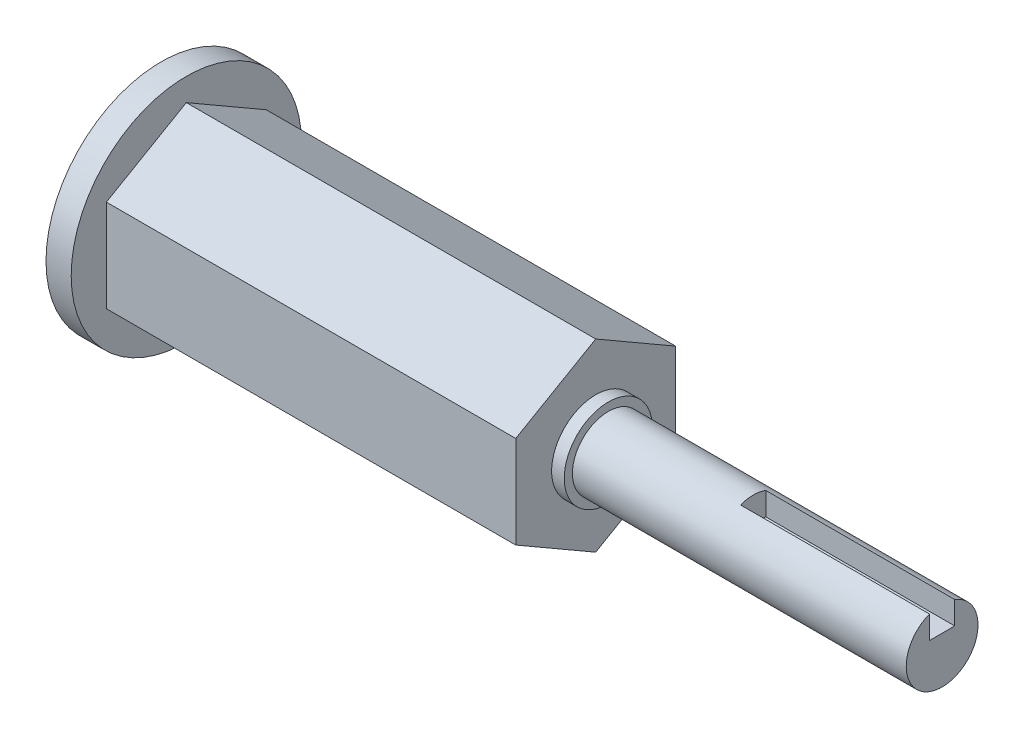
ISO-10303-21;
HEADER;
FILE_DESCRIPTION(('STEP AP214'),'2;1');
FILE_NAME('part.step','',(''),(''),'','','');
FILE_SCHEMA(('AUTOMOTIVE_DESIGN { 1 0 10303 214 1 1 1 1 }'));
ENDSEC;
DATA;
#1=APPLICATION_CONTEXT('core data for automotive mechanical design processes');
#2=APPLICATION_PROTOCOL_DEFINITION('international standard','automotive_design',2000,#1);
#3=PRODUCT_CONTEXT('',#1,'mechanical');
#4=PRODUCT('Part','Part','',(#3));
#5=PRODUCT_RELATED_PRODUCT_CATEGORY('part','',(#4));
#6=PRODUCT_DEFINITION_FORMATION('','',#4);
#7=PRODUCT_DEFINITION_CONTEXT('part definition',#1,'design');
#8=PRODUCT_DEFINITION('design','',#6,#7);
#9=PRODUCT_DEFINITION_SHAPE('','',#8);
#10=(LENGTH_UNIT() NAMED_UNIT(*) SI_UNIT(.MILLI.,.METRE.));
#11=(NAMED_UNIT(*) PLANE_ANGLE_UNIT() SI_UNIT($,.RADIAN.));
#12=(NAMED_UNIT(*) SI_UNIT($,.STERADIAN.) SOLID_ANGLE_UNIT());
#13=UNCERTAINTY_MEASURE_WITH_UNIT(LENGTH_MEASURE(1.E-05),#10,'distance_accuracy_value','');
#14=(GEOMETRIC_REPRESENTATION_CONTEXT(3) GLOBAL_UNCERTAINTY_ASSIGNED_CONTEXT((#13)) GLOBAL_UNIT_ASSIGNED_CONTEXT((#10,
#11,#12)) REPRESENTATION_CONTEXT('',''));
#15=CARTESIAN_POINT('',(0.,0.,0.));
#16=DIRECTION('',(0.,0.,1.));
#17=DIRECTION('',(1.,0.,0.));
#18=AXIS2_PLACEMENT_3D('',#15,#16,#17);
#19=CARTESIAN_POINT('',(0.,0.,0.));
#20=DIRECTION('',(-1.,0.,0.));
#21=DIRECTION('',(0.,0.,1.));
#22=AXIS2_PLACEMENT_3D('',#19,#20,#21);
#23=PLANE('',#22);
#24=CARTESIAN_POINT('',(0.,0.,0.));
#25=DIRECTION('',(-1.,0.,0.));
#26=DIRECTION('',(0.,0.,1.));
#27=AXIS2_PLACEMENT_3D('',#24,#25,#26);
#28=CIRCLE('',#27,9.141);
#29=CARTESIAN_POINT('',(0.,0.,9.141));
#30=VERTEX_POINT('',#29);
#31=EDGE_CURVE('E191',#30,#30,#28,.T.);
#32=ORIENTED_EDGE('',*,*,#31,.F.);
#33=EDGE_LOOP('',(#32));
#34=FACE_BOUND('',#33,.T.);
#35=DIRECTION('',(0.,-0.5,0.866025403784439));
#36=VECTOR('',#35,1.);
#37=CARTESIAN_POINT('',(0.,7.33,0.));
#38=LINE('',#37,#36);
#39=CARTESIAN_POINT('',(0.,7.33,0.));
#40=VERTEX_POINT('',#39);
#41=CARTESIAN_POINT('',(0.,3.665,6.34796620973994));
#42=VERTEX_POINT('',#41);
#43=EDGE_CURVE('E146',#40,#42,#38,.T.);
#44=ORIENTED_EDGE('',*,*,#43,.F.);
#45=DIRECTION('',(0.,0.5,0.866025403784439));
#46=VECTOR('',#45,1.);
#47=CARTESIAN_POINT('',(0.,3.665,-6.34796620973994));
#48=LINE('',#47,#46);
#49=CARTESIAN_POINT('',(0.,3.665,-6.34796620973994));
#50=VERTEX_POINT('',#49);
#51=EDGE_CURVE('E152',#50,#40,#48,.T.);
#52=ORIENTED_EDGE('',*,*,#51,.F.);
#53=DIRECTION('',(0.,1.,0.));
#54=VECTOR('',#53,1.);
#55=CARTESIAN_POINT('',(0.,-3.665,-6.34796620973994));
#56=LINE('',#55,#54);
#57=CARTESIAN_POINT('',(0.,-3.665,-6.34796620973994));
#58=VERTEX_POINT('',#57);
#59=EDGE_CURVE('E170',#58,#50,#56,.T.);
#60=ORIENTED_EDGE('',*,*,#59,.F.);
#61=DIRECTION('',(0.,0.5,-0.866025403784439));
#62=VECTOR('',#61,1.);
#63=CARTESIAN_POINT('',(0.,-7.33,0.));
#64=LINE('',#63,#62);
#65=CARTESIAN_POINT('',(0.,-7.33,0.));
#66=VERTEX_POINT('',#65);
#67=EDGE_CURVE('E167',#66,#58,#64,.T.);
#68=ORIENTED_EDGE('',*,*,#67,.F.);
#69=DIRECTION('',(0.,-0.5,-0.866025403784439));
#70=VECTOR('',#69,1.);
#71=CARTESIAN_POINT('',(0.,-3.665,6.34796620973994));
#72=LINE('',#71,#70);
#73=CARTESIAN_POINT('',(0.,-3.665,6.34796620973994));
#74=VERTEX_POINT('',#73);
#75=EDGE_CURVE('E60',#74,#66,#72,.T.);
#76=ORIENTED_EDGE('',*,*,#75,.F.);
#77=DIRECTION('',(0.,-1.,0.));
#78=VECTOR('',#77,1.);
#79=CARTESIAN_POINT('',(0.,3.665,6.34796620973994));
#80=LINE('',#79,#78);
#81=EDGE_CURVE('E55',#42,#74,#80,.T.);
#82=ORIENTED_EDGE('',*,*,#81,.F.);
#83=EDGE_LOOP('',(#44,#52,#60,#68,#76,#82));
#84=FACE_BOUND('',#83,.T.);
#85=ADVANCED_FACE('F39',(#34,#84),#23,.F.);
#86=CARTESIAN_POINT('',(-2.,0.,0.));
#87=DIRECTION('',(1.,0.,0.));
#88=DIRECTION('',(0.,0.,-1.));
#89=AXIS2_PLACEMENT_3D('',#86,#87,#88);
#90=CYLINDRICAL_SURFACE('',#89,9.141);
#91=CARTESIAN_POINT('',(-2.,0.,0.));
#92=DIRECTION('',(-1.,0.,0.));
#93=DIRECTION('',(0.,0.,1.));
#94=AXIS2_PLACEMENT_3D('',#91,#92,#93);
#95=CIRCLE('',#94,9.141);
#96=CARTESIAN_POINT('',(-2.,0.,9.141));
#97=VERTEX_POINT('',#96);
#98=EDGE_CURVE('E192',#97,#97,#95,.T.);
#99=ORIENTED_EDGE('',*,*,#98,.F.);
#100=EDGE_LOOP('',(#99));
#101=FACE_BOUND('',#100,.T.);
#102=ORIENTED_EDGE('',*,*,#31,.T.);
#103=EDGE_LOOP('',(#102));
#104=FACE_BOUND('',#103,.T.);
#105=ADVANCED_FACE('F235',(#101,#104),#90,.T.);
#106=CARTESIAN_POINT('',(-2.,0.,0.));
#107=DIRECTION('',(-1.,0.,0.));
#108=DIRECTION('',(0.,0.,1.));
#109=AXIS2_PLACEMENT_3D('',#106,#107,#108);
#110=PLANE('',#109);
#111=ORIENTED_EDGE('',*,*,#98,.T.);
#112=EDGE_LOOP('',(#111));
#113=FACE_BOUND('',#112,.T.);
#114=ADVANCED_FACE('F243',(#113),#110,.T.);
#115=CARTESIAN_POINT('',(32.5,7.33,0.));
#116=DIRECTION('',(0.,-0.866025403784439,-0.5));
#117=DIRECTION('',(0.,0.5,-0.866025403784439));
#118=AXIS2_PLACEMENT_3D('',#115,#116,#117);
#119=PLANE('',#118);
#120=ORIENTED_EDGE('',*,*,#43,.T.);
#121=DIRECTION('',(-1.,0.,0.));
#122=VECTOR('',#121,1.);
#123=CARTESIAN_POINT('',(32.5,3.665,6.34796620973994));
#124=LINE('',#123,#122);
#125=CARTESIAN_POINT('',(32.5,3.665,6.34796620973994));
#126=VERTEX_POINT('',#125);
#127=EDGE_CURVE('E189',#126,#42,#124,.T.);
#128=ORIENTED_EDGE('',*,*,#127,.F.);
#129=DIRECTION('',(0.,-0.5,0.866025403784439));
#130=VECTOR('',#129,1.);
#131=CARTESIAN_POINT('',(32.5,7.33,0.));
#132=LINE('',#131,#130);
#133=CARTESIAN_POINT('',(32.5,7.33,0.));
#134=VERTEX_POINT('',#133);
#135=EDGE_CURVE('E148',#134,#126,#132,.T.);
#136=ORIENTED_EDGE('',*,*,#135,.F.);
#137=DIRECTION('',(-1.,0.,0.));
#138=VECTOR('',#137,1.);
#139=CARTESIAN_POINT('',(32.5,7.33,0.));
#140=LINE('',#139,#138);
#141=EDGE_CURVE('E162',#134,#40,#140,.T.);
#142=ORIENTED_EDGE('',*,*,#141,.T.);
#143=EDGE_LOOP('',(#120,#128,#136,#142));
#144=FACE_BOUND('',#143,.T.);
#145=ADVANCED_FACE('F282',(#144),#119,.F.);
#146=CARTESIAN_POINT('',(32.5,3.665,6.34796620973994));
#147=DIRECTION('',(0.,0.,-1.));
#148=DIRECTION('',(-1.,0.,0.));
#149=AXIS2_PLACEMENT_3D('',#146,#147,#148);
#150=PLANE('',#149);
#151=ORIENTED_EDGE('',*,*,#81,.T.);
#152=DIRECTION('',(-1.,0.,0.));
#153=VECTOR('',#152,1.);
#154=CARTESIAN_POINT('',(32.5,-3.665,6.34796620973994));
#155=LINE('',#154,#153);
#156=CARTESIAN_POINT('',(32.5,-3.665,6.34796620973994));
#157=VERTEX_POINT('',#156);
#158=EDGE_CURVE('E186',#157,#74,#155,.T.);
#159=ORIENTED_EDGE('',*,*,#158,.F.);
#160=DIRECTION('',(0.,-1.,0.));
#161=VECTOR('',#160,1.);
#162=CARTESIAN_POINT('',(32.5,3.665,6.34796620973994));
#163=LINE('',#162,#161);
#164=EDGE_CURVE('E151',#126,#157,#163,.T.);
#165=ORIENTED_EDGE('',*,*,#164,.F.);
#166=ORIENTED_EDGE('',*,*,#127,.T.);
#167=EDGE_LOOP('',(#151,#159,#165,#166));
#168=FACE_BOUND('',#167,.T.);
#169=ADVANCED_FACE('F279',(#168),#150,.F.);
#170=CARTESIAN_POINT('',(32.5,-3.665,6.34796620973994));
#171=DIRECTION('',(0.,0.866025403784439,-0.5));
#172=DIRECTION('',(0.,0.5,0.866025403784439));
#173=AXIS2_PLACEMENT_3D('',#170,#171,#172);
#174=PLANE('',#173);
#175=ORIENTED_EDGE('',*,*,#75,.T.);
#176=DIRECTION('',(-1.,0.,0.));
#177=VECTOR('',#176,1.);
#178=CARTESIAN_POINT('',(32.5,-7.33,0.));
#179=LINE('',#178,#177);
#180=CARTESIAN_POINT('',(32.5,-7.33,0.));
#181=VERTEX_POINT('',#180);
#182=EDGE_CURVE('E183',#181,#66,#179,.T.);
#183=ORIENTED_EDGE('',*,*,#182,.F.);
#184=DIRECTION('',(0.,-0.5,-0.866025403784439));
#185=VECTOR('',#184,1.);
#186=CARTESIAN_POINT('',(32.5,-3.665,6.34796620973994));
#187=LINE('',#186,#185);
#188=EDGE_CURVE('E154',#157,#181,#187,.T.);
#189=ORIENTED_EDGE('',*,*,#188,.F.);
#190=ORIENTED_EDGE('',*,*,#158,.T.);
#191=EDGE_LOOP('',(#175,#183,#189,#190));
#192=FACE_BOUND('',#191,.T.);
#193=ADVANCED_FACE('F275',(#192),#174,.F.);
#194=CARTESIAN_POINT('',(32.5,-7.33,0.));
#195=DIRECTION('',(0.,0.866025403784438,0.5));
#196=DIRECTION('',(0.,-0.5,0.866025403784439));
#197=AXIS2_PLACEMENT_3D('',#194,#195,#196);
#198=PLANE('',#197);
#199=ORIENTED_EDGE('',*,*,#67,.T.);
#200=DIRECTION('',(-1.,0.,0.));
#201=VECTOR('',#200,1.);
#202=CARTESIAN_POINT('',(32.5,-3.665,-6.34796620973994));
#203=LINE('',#202,#201);
#204=CARTESIAN_POINT('',(32.5,-3.665,-6.34796620973994));
#205=VERTEX_POINT('',#204);
#206=EDGE_CURVE('E180',#205,#58,#203,.T.);
#207=ORIENTED_EDGE('',*,*,#206,.F.);
#208=DIRECTION('',(0.,0.5,-0.866025403784439));
#209=VECTOR('',#208,1.);
#210=CARTESIAN_POINT('',(32.5,-7.33,0.));
#211=LINE('',#210,#209);
#212=EDGE_CURVE('E156',#181,#205,#211,.T.);
#213=ORIENTED_EDGE('',*,*,#212,.F.);
#214=ORIENTED_EDGE('',*,*,#182,.T.);
#215=EDGE_LOOP('',(#199,#207,#213,#214));
#216=FACE_BOUND('',#215,.T.);
#217=ADVANCED_FACE('F271',(#216),#198,.F.);
#218=CARTESIAN_POINT('',(32.5,-3.665,-6.34796620973994));
#219=DIRECTION('',(0.,0.,1.));
#220=DIRECTION('',(1.,0.,0.));
#221=AXIS2_PLACEMENT_3D('',#218,#219,#220);
#222=PLANE('',#221);
#223=ORIENTED_EDGE('',*,*,#59,.T.);
#224=DIRECTION('',(-1.,0.,0.));
#225=VECTOR('',#224,1.);
#226=CARTESIAN_POINT('',(32.5,3.665,-6.34796620973994));
#227=LINE('',#226,#225);
#228=CARTESIAN_POINT('',(32.5,3.665,-6.34796620973994));
#229=VERTEX_POINT('',#228);
#230=EDGE_CURVE('E177',#229,#50,#227,.T.);
#231=ORIENTED_EDGE('',*,*,#230,.F.);
#232=DIRECTION('',(0.,1.,0.));
#233=VECTOR('',#232,1.);
#234=CARTESIAN_POINT('',(32.5,-3.665,-6.34796620973994));
#235=LINE('',#234,#233);
#236=EDGE_CURVE('E158',#205,#229,#235,.T.);
#237=ORIENTED_EDGE('',*,*,#236,.F.);
#238=ORIENTED_EDGE('',*,*,#206,.T.);
#239=EDGE_LOOP('',(#223,#231,#237,#238));
#240=FACE_BOUND('',#239,.T.);
#241=ADVANCED_FACE('F267',(#240),#222,.F.);
#242=CARTESIAN_POINT('',(32.5,3.665,-6.34796620973994));
#243=DIRECTION('',(0.,-0.866025403784439,0.5));
#244=DIRECTION('',(0.,-0.5,-0.866025403784439));
#245=AXIS2_PLACEMENT_3D('',#242,#243,#244);
#246=PLANE('',#245);
#247=ORIENTED_EDGE('',*,*,#51,.T.);
#248=ORIENTED_EDGE('',*,*,#141,.F.);
#249=DIRECTION('',(0.,0.5,0.866025403784439));
#250=VECTOR('',#249,1.);
#251=CARTESIAN_POINT('',(32.5,3.665,-6.34796620973994));
#252=LINE('',#251,#250);
#253=EDGE_CURVE('E160',#229,#134,#252,.T.);
#254=ORIENTED_EDGE('',*,*,#253,.F.);
#255=ORIENTED_EDGE('',*,*,#230,.T.);
#256=EDGE_LOOP('',(#247,#248,#254,#255));
#257=FACE_BOUND('',#256,.T.);
#258=ADVANCED_FACE('F264',(#257),#246,.F.);
#259=CARTESIAN_POINT('',(32.5,0.,0.));
#260=DIRECTION('',(1.,0.,0.));
#261=DIRECTION('',(0.,0.,-1.));
#262=AXIS2_PLACEMENT_3D('',#259,#260,#261);
#263=PLANE('',#262);
#264=CARTESIAN_POINT('',(32.5,0.,0.));
#265=DIRECTION('',(1.,0.,0.));
#266=DIRECTION('',(0.,0.,-1.));
#267=AXIS2_PLACEMENT_3D('',#264,#265,#266);
#268=CIRCLE('',#267,3.5);
#269=CARTESIAN_POINT('',(32.5,0.,-3.5));
#270=VERTEX_POINT('',#269);
#271=EDGE_CURVE('E210',#270,#270,#268,.T.);
#272=ORIENTED_EDGE('',*,*,#271,.F.);
#273=EDGE_LOOP('',(#272));
#274=FACE_BOUND('',#273,.T.);
#275=ORIENTED_EDGE('',*,*,#135,.T.);
#276=ORIENTED_EDGE('',*,*,#164,.T.);
#277=ORIENTED_EDGE('',*,*,#188,.T.);
#278=ORIENTED_EDGE('',*,*,#212,.T.);
#279=ORIENTED_EDGE('',*,*,#236,.T.);
#280=ORIENTED_EDGE('',*,*,#253,.T.);
#281=EDGE_LOOP('',(#275,#276,#277,#278,#279,#280));
#282=FACE_BOUND('',#281,.T.);
#283=ADVANCED_FACE('F231',(#274,#282),#263,.T.);
#284=CARTESIAN_POINT('',(33.5,0.,0.));
#285=DIRECTION('',(-1.,0.,0.));
#286=DIRECTION('',(0.,0.,1.));
#287=AXIS2_PLACEMENT_3D('',#284,#285,#286);
#288=CYLINDRICAL_SURFACE('',#287,3.5);
#289=CARTESIAN_POINT('',(33.5,0.,0.));
#290=DIRECTION('',(1.,0.,0.));
#291=DIRECTION('',(0.,0.,-1.));
#292=AXIS2_PLACEMENT_3D('',#289,#290,#291);
#293=CIRCLE('',#292,3.5);
#294=CARTESIAN_POINT('',(33.5,0.,-3.5));
#295=VERTEX_POINT('',#294);
#296=EDGE_CURVE('E213',#295,#295,#293,.T.);
#297=ORIENTED_EDGE('',*,*,#296,.F.);
#298=EDGE_LOOP('',(#297));
#299=FACE_BOUND('',#298,.T.);
#300=ORIENTED_EDGE('',*,*,#271,.T.);
#301=EDGE_LOOP('',(#300));
#302=FACE_BOUND('',#301,.T.);
#303=ADVANCED_FACE('F223',(#299,#302),#288,.T.);
#304=CARTESIAN_POINT('',(33.5,0.,0.));
#305=DIRECTION('',(1.,0.,0.));
#306=DIRECTION('',(0.,0.,-1.));
#307=AXIS2_PLACEMENT_3D('',#304,#305,#306);
#308=PLANE('',#307);
#309=CARTESIAN_POINT('',(33.5,0.,0.));
#310=DIRECTION('',(1.,0.,0.));
#311=DIRECTION('',(0.,0.,-1.));
#312=AXIS2_PLACEMENT_3D('',#309,#310,#311);
#313=CIRCLE('',#312,2.85);
#314=CARTESIAN_POINT('',(33.5,0.,-2.85));
#315=VERTEX_POINT('',#314);
#316=EDGE_CURVE('E43',#315,#315,#313,.T.);
#317=ORIENTED_EDGE('',*,*,#316,.F.);
#318=EDGE_LOOP('',(#317));
#319=FACE_BOUND('',#318,.T.);
#320=ORIENTED_EDGE('',*,*,#296,.T.);
#321=EDGE_LOOP('',(#320));
#322=FACE_BOUND('',#321,.T.);
#323=ADVANCED_FACE('F221',(#319,#322),#308,.T.);
#324=CARTESIAN_POINT('',(45.,0.85,-1.));
#325=DIRECTION('',(0.,-1.,0.));
#326=DIRECTION('',(0.,0.,-1.));
#327=AXIS2_PLACEMENT_3D('',#324,#325,#326);
#328=PLANE('',#327);
#329=DIRECTION('',(0.,0.,-1.));
#330=VECTOR('',#329,1.);
#331=CARTESIAN_POINT('',(60.,0.85,-1.));
#332=LINE('',#331,#330);
#333=CARTESIAN_POINT('',(60.,0.85,1.));
#334=VERTEX_POINT('',#333);
#335=CARTESIAN_POINT('',(60.,0.85,-1.));
#336=VERTEX_POINT('',#335);
#337=EDGE_CURVE('E144',#334,#336,#332,.T.);
#338=ORIENTED_EDGE('',*,*,#337,.T.);
#339=DIRECTION('',(1.,0.,0.));
#340=VECTOR('',#339,1.);
#341=CARTESIAN_POINT('',(45.,0.85,-1.));
#342=LINE('',#341,#340);
#343=CARTESIAN_POINT('',(45.,0.85,-1.));
#344=VERTEX_POINT('',#343);
#345=EDGE_CURVE('E134',#344,#336,#342,.T.);
#346=ORIENTED_EDGE('',*,*,#345,.F.);
#347=DIRECTION('',(0.,0.,-1.));
#348=VECTOR('',#347,1.);
#349=CARTESIAN_POINT('',(45.,0.85,-1.));
#350=LINE('',#349,#348);
#351=CARTESIAN_POINT('',(45.,0.85,1.));
#352=VERTEX_POINT('',#351);
#353=EDGE_CURVE('E120',#352,#344,#350,.T.);
#354=ORIENTED_EDGE('',*,*,#353,.F.);
#355=DIRECTION('',(1.,0.,0.));
#356=VECTOR('',#355,1.);
#357=CARTESIAN_POINT('',(45.,0.85,1.));
#358=LINE('',#357,#356);
#359=EDGE_CURVE('E127',#352,#334,#358,.T.);
#360=ORIENTED_EDGE('',*,*,#359,.T.);
#361=EDGE_LOOP('',(#338,#346,#354,#360));
#362=FACE_BOUND('',#361,.T.);
#363=ADVANCED_FACE('F136',(#362),#328,.F.);
#364=CARTESIAN_POINT('',(45.,0.85,1.));
#365=DIRECTION('',(0.,0.,1.));
#366=DIRECTION('',(0.,-1.,0.));
#367=AXIS2_PLACEMENT_3D('',#364,#365,#366);
#368=PLANE('',#367);
#369=DIRECTION('',(0.,-1.,0.));
#370=VECTOR('',#369,1.);
#371=CARTESIAN_POINT('',(60.,0.85,1.));
#372=LINE('',#371,#370);
#373=CARTESIAN_POINT('',(60.,2.6688012290165,1.));
#374=VERTEX_POINT('',#373);
#375=EDGE_CURVE('E130',#374,#334,#372,.T.);
#376=ORIENTED_EDGE('',*,*,#375,.T.);
#377=ORIENTED_EDGE('',*,*,#359,.F.);
#378=DIRECTION('',(0.,-1.,0.));
#379=VECTOR('',#378,1.);
#380=CARTESIAN_POINT('',(45.,0.85,1.));
#381=LINE('',#380,#379);
#382=CARTESIAN_POINT('',(45.,2.6688012290165,1.));
#383=VERTEX_POINT('',#382);
#384=EDGE_CURVE('E115',#383,#352,#381,.T.);
#385=ORIENTED_EDGE('',*,*,#384,.F.);
#386=DIRECTION('',(-1.,0.,0.));
#387=VECTOR('',#386,1.);
#388=CARTESIAN_POINT('',(60.,2.6688012290165,1.));
#389=LINE('',#388,#387);
#390=EDGE_CURVE('E48',#374,#383,#389,.T.);
#391=ORIENTED_EDGE('',*,*,#390,.F.);
#392=EDGE_LOOP('',(#376,#377,#385,#391));
#393=FACE_BOUND('',#392,.T.);
#394=ADVANCED_FACE('F128',(#393),#368,.F.);
#395=CARTESIAN_POINT('',(60.,0.,0.));
#396=DIRECTION('',(1.,0.,0.));
#397=DIRECTION('',(0.,0.,-1.));
#398=AXIS2_PLACEMENT_3D('',#395,#396,#397);
#399=PLANE('',#398);
#400=DIRECTION('',(0.,1.,0.));
#401=VECTOR('',#400,1.);
#402=CARTESIAN_POINT('',(60.,0.85,-1.));
#403=LINE('',#402,#401);
#404=CARTESIAN_POINT('',(60.,2.6688012290165,-1.));
#405=VERTEX_POINT('',#404);
#406=EDGE_CURVE('E141',#336,#405,#403,.T.);
#407=ORIENTED_EDGE('',*,*,#406,.F.);
#408=ORIENTED_EDGE('',*,*,#337,.F.);
#409=ORIENTED_EDGE('',*,*,#375,.F.);
#410=CARTESIAN_POINT('',(60.,0.,0.));
#411=DIRECTION('',(1.,0.,0.));
#412=DIRECTION('',(0.,0.,-1.));
#413=AXIS2_PLACEMENT_3D('',#410,#411,#412);
#414=CIRCLE('',#413,2.85);
#415=EDGE_CURVE('E195',#374,#405,#414,.T.);
#416=ORIENTED_EDGE('',*,*,#415,.T.);
#417=EDGE_LOOP('',(#407,#408,#409,#416));
#418=FACE_BOUND('',#417,.T.);
#419=ADVANCED_FACE('F206',(#418),#399,.T.);
#420=CARTESIAN_POINT('',(45.,0.85,-1.));
#421=DIRECTION('',(0.,0.,-1.));
#422=DIRECTION('',(-1.,0.,0.));
#423=AXIS2_PLACEMENT_3D('',#420,#421,#422);
#424=PLANE('',#423);
#425=DIRECTION('',(0.,1.,0.));
#426=VECTOR('',#425,1.);
#427=CARTESIAN_POINT('',(45.,0.85,-1.));
#428=LINE('',#427,#426);
#429=CARTESIAN_POINT('',(45.,2.6688012290165,-1.));
#430=VERTEX_POINT('',#429);
#431=EDGE_CURVE('E124',#344,#430,#428,.T.);
#432=ORIENTED_EDGE('',*,*,#431,.F.);
#433=ORIENTED_EDGE('',*,*,#345,.T.);
#434=ORIENTED_EDGE('',*,*,#406,.T.);
#435=DIRECTION('',(-1.,0.,0.));
#436=VECTOR('',#435,1.);
#437=CARTESIAN_POINT('',(60.,2.6688012290165,-1.));
#438=LINE('',#437,#436);
#439=EDGE_CURVE('E11',#430,#405,#438,.F.);
#440=ORIENTED_EDGE('',*,*,#439,.F.);
#441=EDGE_LOOP('',(#432,#433,#434,#440));
#442=FACE_BOUND('',#441,.T.);
#443=ADVANCED_FACE('F208',(#442),#424,.F.);
#444=CARTESIAN_POINT('',(45.,0.,0.));
#445=DIRECTION('',(1.,0.,0.));
#446=DIRECTION('',(0.,0.,-1.));
#447=AXIS2_PLACEMENT_3D('',#444,#445,#446);
#448=PLANE('',#447);
#449=ORIENTED_EDGE('',*,*,#431,.T.);
#450=CARTESIAN_POINT('',(45.,0.,0.));
#451=DIRECTION('',(1.,0.,0.));
#452=DIRECTION('',(0.,0.,-1.));
#453=AXIS2_PLACEMENT_3D('',#450,#451,#452);
#454=CIRCLE('',#453,2.85);
#455=EDGE_CURVE('E121',#430,#383,#454,.T.);
#456=ORIENTED_EDGE('',*,*,#455,.T.);
#457=ORIENTED_EDGE('',*,*,#384,.T.);
#458=ORIENTED_EDGE('',*,*,#353,.T.);
#459=EDGE_LOOP('',(#449,#456,#457,#458));
#460=FACE_BOUND('',#459,.T.);
#461=ADVANCED_FACE('F118',(#460),#448,.T.);
#462=CARTESIAN_POINT('',(60.,0.,0.));
#463=DIRECTION('',(-1.,0.,0.));
#464=DIRECTION('',(0.,0.,1.));
#465=AXIS2_PLACEMENT_3D('',#462,#463,#464);
#466=CYLINDRICAL_SURFACE('',#465,2.85);
#467=ORIENTED_EDGE('',*,*,#316,.T.);
#468=EDGE_LOOP('',(#467));
#469=FACE_BOUND('',#468,.T.);
#470=ORIENTED_EDGE('',*,*,#455,.F.);
#471=ORIENTED_EDGE('',*,*,#439,.T.);
#472=ORIENTED_EDGE('',*,*,#415,.F.);
#473=ORIENTED_EDGE('',*,*,#390,.T.);
#474=EDGE_LOOP('',(#470,#471,#472,#473));
#475=FACE_BOUND('',#474,.T.);
#476=ADVANCED_FACE('F41',(#469,#475),#466,.T.);
#477=CLOSED_SHELL('',(#85,#105,#114,#145,#169,#193,#217,#241,#258,#283,#303,#323,#363,#394,#419,
#443,#461,#476));
#478=MANIFOLD_SOLID_BREP('B2',#477);
#479=ADVANCED_BREP_SHAPE_REPRESENTATION('',(#18,#478),#14);
#480=SHAPE_DEFINITION_REPRESENTATION(#9,#479);
ENDSEC;
END-ISO-10303-21;
